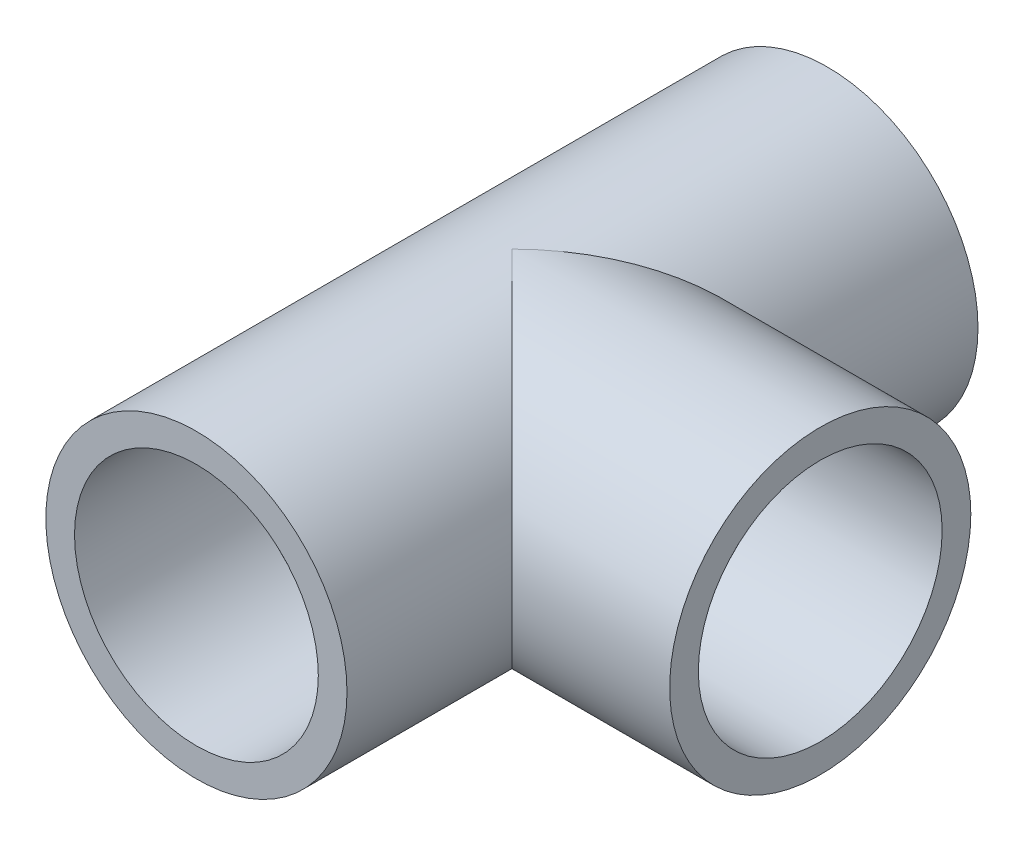
ISO-10303-21;
HEADER;
FILE_DESCRIPTION(('STEP AP214'),'2;1');
FILE_NAME('part.step','',(''),(''),'','','');
FILE_SCHEMA(('AUTOMOTIVE_DESIGN { 1 0 10303 214 1 1 1 1 }'));
ENDSEC;
DATA;
#1=APPLICATION_CONTEXT('core data for automotive mechanical design processes');
#2=APPLICATION_PROTOCOL_DEFINITION('international standard','automotive_design',2000,#1);
#3=PRODUCT_CONTEXT('',#1,'mechanical');
#4=PRODUCT('Part','Part','',(#3));
#5=PRODUCT_RELATED_PRODUCT_CATEGORY('part','',(#4));
#6=PRODUCT_DEFINITION_FORMATION('','',#4);
#7=PRODUCT_DEFINITION_CONTEXT('part definition',#1,'design');
#8=PRODUCT_DEFINITION('design','',#6,#7);
#9=PRODUCT_DEFINITION_SHAPE('','',#8);
#10=(LENGTH_UNIT() NAMED_UNIT(*) SI_UNIT(.MILLI.,.METRE.));
#11=(NAMED_UNIT(*) PLANE_ANGLE_UNIT() SI_UNIT($,.RADIAN.));
#12=(NAMED_UNIT(*) SI_UNIT($,.STERADIAN.) SOLID_ANGLE_UNIT());
#13=UNCERTAINTY_MEASURE_WITH_UNIT(LENGTH_MEASURE(1.E-05),#10,'distance_accuracy_value','');
#14=(GEOMETRIC_REPRESENTATION_CONTEXT(3) GLOBAL_UNCERTAINTY_ASSIGNED_CONTEXT((#13)) GLOBAL_UNIT_ASSIGNED_CONTEXT((#10,
#11,#12)) REPRESENTATION_CONTEXT('',''));
#15=CARTESIAN_POINT('',(0.,0.,0.));
#16=DIRECTION('',(0.,0.,1.));
#17=DIRECTION('',(1.,0.,0.));
#18=AXIS2_PLACEMENT_3D('',#15,#16,#17);
#19=CARTESIAN_POINT('',(0.,0.,69.85));
#20=DIRECTION('',(0.,0.,-1.));
#21=DIRECTION('',(-1.,0.,0.));
#22=AXIS2_PLACEMENT_3D('',#19,#20,#21);
#23=CYLINDRICAL_SURFACE('',#22,12.7);
#24=CARTESIAN_POINT('',(0.,0.,50.8));
#25=DIRECTION('',(0.,0.,1.));
#26=DIRECTION('',(1.,0.,0.));
#27=AXIS2_PLACEMENT_3D('',#24,#25,#26);
#28=CIRCLE('',#27,12.7);
#29=CARTESIAN_POINT('',(12.7,0.,50.8));
#30=VERTEX_POINT('',#29);
#31=EDGE_CURVE('E114',#30,#30,#28,.F.);
#32=ORIENTED_EDGE('',*,*,#31,.F.);
#33=EDGE_LOOP('',(#32));
#34=FACE_BOUND('',#33,.T.);
#35=DIRECTION('',(0.,0.,-1.));
#36=VECTOR('',#35,1.);
#37=CARTESIAN_POINT('',(3.65125,-12.1638140991015,69.85));
#38=LINE('',#37,#36);
#39=CARTESIAN_POINT('',(3.65125,-12.1638140991015,38.57625));
#40=VERTEX_POINT('',#39);
#41=CARTESIAN_POINT('',(3.65125,-12.1638140991015,31.27375));
#42=VERTEX_POINT('',#41);
#43=EDGE_CURVE('E11',#40,#42,#38,.T.);
#44=ORIENTED_EDGE('',*,*,#43,.T.);
#45=CARTESIAN_POINT('',(0.,0.,34.925));
#46=DIRECTION('',(0.707106781186547,0.,0.707106781186548));
#47=DIRECTION('',(0.707106781186547,0.,-0.707106781186548));
#48=AXIS2_PLACEMENT_3D('',#45,#46,#47);
#49=ELLIPSE('',#48,17.9605122421383,12.7);
#50=CARTESIAN_POINT('',(3.65125,12.1638140991015,31.27375));
#51=VERTEX_POINT('',#50);
#52=EDGE_CURVE('E56',#51,#42,#49,.F.);
#53=ORIENTED_EDGE('',*,*,#52,.F.);
#54=DIRECTION('',(0.,0.,-1.));
#55=VECTOR('',#54,1.);
#56=CARTESIAN_POINT('',(3.65125,12.1638140991015,69.85));
#57=LINE('',#56,#55);
#58=CARTESIAN_POINT('',(3.65125,12.1638140991015,38.57625));
#59=VERTEX_POINT('',#58);
#60=EDGE_CURVE('E49',#51,#59,#57,.F.);
#61=ORIENTED_EDGE('',*,*,#60,.T.);
#62=CARTESIAN_POINT('',(0.,0.,34.925));
#63=DIRECTION('',(0.707106781186547,0.,-0.707106781186548));
#64=DIRECTION('',(0.707106781186547,0.,0.707106781186548));
#65=AXIS2_PLACEMENT_3D('',#62,#63,#64);
#66=ELLIPSE('',#65,17.9605122421383,12.7);
#67=EDGE_CURVE('E75',#40,#59,#66,.F.);
#68=ORIENTED_EDGE('',*,*,#67,.F.);
#69=EDGE_LOOP('',(#44,#53,#61,#68));
#70=FACE_BOUND('',#69,.T.);
#71=CARTESIAN_POINT('',(0.,0.,19.05));
#72=DIRECTION('',(0.,0.,-1.));
#73=DIRECTION('',(-1.,0.,0.));
#74=AXIS2_PLACEMENT_3D('',#71,#72,#73);
#75=CIRCLE('',#74,12.7);
#76=CARTESIAN_POINT('',(-12.7,0.,19.05));
#77=VERTEX_POINT('',#76);
#78=EDGE_CURVE('E43',#77,#77,#75,.F.);
#79=ORIENTED_EDGE('',*,*,#78,.F.);
#80=EDGE_LOOP('',(#79));
#81=FACE_BOUND('',#80,.T.);
#82=ADVANCED_FACE('F39',(#34,#70,#81),#23,.F.);
#83=CARTESIAN_POINT('',(3.65125,0.,34.925));
#84=DIRECTION('',(1.,0.,0.));
#85=DIRECTION('',(0.,0.,-1.));
#86=AXIS2_PLACEMENT_3D('',#83,#84,#85);
#87=CYLINDRICAL_SURFACE('',#86,12.7);
#88=CARTESIAN_POINT('',(3.65125,0.,34.925));
#89=DIRECTION('',(1.,0.,0.));
#90=DIRECTION('',(0.,0.,-1.));
#91=AXIS2_PLACEMENT_3D('',#88,#89,#90);
#92=CIRCLE('',#91,12.7);
#93=EDGE_CURVE('E89',#40,#42,#92,.T.);
#94=ORIENTED_EDGE('',*,*,#93,.F.);
#95=ORIENTED_EDGE('',*,*,#67,.T.);
#96=EDGE_CURVE('E87',#51,#59,#92,.T.);
#97=ORIENTED_EDGE('',*,*,#96,.F.);
#98=ORIENTED_EDGE('',*,*,#52,.T.);
#99=EDGE_LOOP('',(#94,#95,#97,#98));
#100=FACE_BOUND('',#99,.T.);
#101=CARTESIAN_POINT('',(15.08125,0.,34.925));
#102=DIRECTION('',(1.,0.,0.));
#103=DIRECTION('',(0.,0.,-1.));
#104=AXIS2_PLACEMENT_3D('',#101,#102,#103);
#105=CIRCLE('',#104,12.7);
#106=CARTESIAN_POINT('',(15.08125,0.,22.225));
#107=VERTEX_POINT('',#106);
#108=EDGE_CURVE('E118',#107,#107,#105,.F.);
#109=ORIENTED_EDGE('',*,*,#108,.F.);
#110=EDGE_LOOP('',(#109));
#111=FACE_BOUND('',#110,.T.);
#112=ADVANCED_FACE('F85',(#100,#111),#87,.F.);
#113=CARTESIAN_POINT('',(3.65125,0.,34.925));
#114=DIRECTION('',(1.,0.,0.));
#115=DIRECTION('',(0.,0.,-1.));
#116=AXIS2_PLACEMENT_3D('',#113,#114,#115);
#117=PLANE('',#116);
#118=ORIENTED_EDGE('',*,*,#43,.F.);
#119=ORIENTED_EDGE('',*,*,#93,.T.);
#120=EDGE_LOOP('',(#118,#119));
#121=FACE_BOUND('',#120,.T.);
#122=ADVANCED_FACE('F145',(#121),#117,.T.);
#123=CARTESIAN_POINT('',(0.,0.,69.85));
#124=DIRECTION('',(0.,0.,-1.));
#125=DIRECTION('',(-1.,0.,0.));
#126=AXIS2_PLACEMENT_3D('',#123,#124,#125);
#127=CYLINDRICAL_SURFACE('',#126,16.66875);
#128=CARTESIAN_POINT('',(0.,0.,0.));
#129=DIRECTION('',(0.,0.,1.));
#130=DIRECTION('',(1.,0.,0.));
#131=AXIS2_PLACEMENT_3D('',#128,#129,#130);
#132=CIRCLE('',#131,16.66875);
#133=CARTESIAN_POINT('',(16.66875,0.,0.));
#134=VERTEX_POINT('',#133);
#135=EDGE_CURVE('E99',#134,#134,#132,.T.);
#136=ORIENTED_EDGE('',*,*,#135,.T.);
#137=EDGE_LOOP('',(#136));
#138=FACE_BOUND('',#137,.T.);
#139=CARTESIAN_POINT('',(0.,0.,69.85));
#140=DIRECTION('',(0.,0.,1.));
#141=DIRECTION('',(1.,0.,0.));
#142=AXIS2_PLACEMENT_3D('',#139,#140,#141);
#143=CIRCLE('',#142,16.66875);
#144=CARTESIAN_POINT('',(16.66875,0.,69.85));
#145=VERTEX_POINT('',#144);
#146=EDGE_CURVE('E103',#145,#145,#143,.T.);
#147=ORIENTED_EDGE('',*,*,#146,.F.);
#148=EDGE_LOOP('',(#147));
#149=FACE_BOUND('',#148,.T.);
#150=CARTESIAN_POINT('',(0.,0.,34.925));
#151=DIRECTION('',(-0.707106781186547,0.,-0.707106781186547));
#152=DIRECTION('',(0.707106781186547,0.,-0.707106781186547));
#153=AXIS2_PLACEMENT_3D('',#150,#151,#152);
#154=ELLIPSE('',#153,23.5731723178065,16.66875);
#155=CARTESIAN_POINT('',(0.,-16.66875,34.925));
#156=VERTEX_POINT('',#155);
#157=CARTESIAN_POINT('',(0.,16.66875,34.925));
#158=VERTEX_POINT('',#157);
#159=EDGE_CURVE('E81',#156,#158,#154,.F.);
#160=ORIENTED_EDGE('',*,*,#159,.F.);
#161=CARTESIAN_POINT('',(0.,0.,34.925));
#162=DIRECTION('',(0.707106781186547,0.,-0.707106781186547));
#163=DIRECTION('',(-0.707106781186547,0.,-0.707106781186547));
#164=AXIS2_PLACEMENT_3D('',#161,#162,#163);
#165=ELLIPSE('',#164,23.5731723178065,16.66875);
#166=EDGE_CURVE('E63',#158,#156,#165,.T.);
#167=ORIENTED_EDGE('',*,*,#166,.F.);
#168=EDGE_LOOP('',(#160,#167));
#169=FACE_BOUND('',#168,.T.);
#170=ADVANCED_FACE('F41',(#138,#149,#169),#127,.T.);
#171=CARTESIAN_POINT('',(0.,0.,69.85));
#172=DIRECTION('',(0.,0.,1.));
#173=DIRECTION('',(1.,0.,0.));
#174=AXIS2_PLACEMENT_3D('',#171,#172,#173);
#175=PLANE('',#174);
#176=CARTESIAN_POINT('',(0.,0.,69.85));
#177=DIRECTION('',(0.,0.,1.));
#178=DIRECTION('',(1.,0.,0.));
#179=AXIS2_PLACEMENT_3D('',#176,#177,#178);
#180=CIRCLE('',#179,13.49375);
#181=CARTESIAN_POINT('',(13.49375,0.,69.85));
#182=VERTEX_POINT('',#181);
#183=EDGE_CURVE('E121',#182,#182,#180,.T.);
#184=ORIENTED_EDGE('',*,*,#183,.F.);
#185=EDGE_LOOP('',(#184));
#186=FACE_BOUND('',#185,.T.);
#187=ORIENTED_EDGE('',*,*,#146,.T.);
#188=EDGE_LOOP('',(#187));
#189=FACE_BOUND('',#188,.T.);
#190=ADVANCED_FACE('F152',(#186,#189),#175,.T.);
#191=CARTESIAN_POINT('',(0.,0.,0.));
#192=DIRECTION('',(0.,0.,1.));
#193=DIRECTION('',(1.,0.,0.));
#194=AXIS2_PLACEMENT_3D('',#191,#192,#193);
#195=PLANE('',#194);
#196=CARTESIAN_POINT('',(0.,0.,0.));
#197=DIRECTION('',(0.,0.,-1.));
#198=DIRECTION('',(-1.,0.,0.));
#199=AXIS2_PLACEMENT_3D('',#196,#197,#198);
#200=CIRCLE('',#199,13.49375);
#201=CARTESIAN_POINT('',(-13.49375,0.,0.));
#202=VERTEX_POINT('',#201);
#203=EDGE_CURVE('E138',#202,#202,#200,.T.);
#204=ORIENTED_EDGE('',*,*,#203,.F.);
#205=EDGE_LOOP('',(#204));
#206=FACE_BOUND('',#205,.T.);
#207=ORIENTED_EDGE('',*,*,#135,.F.);
#208=EDGE_LOOP('',(#207));
#209=FACE_BOUND('',#208,.T.);
#210=ADVANCED_FACE('F201',(#206,#209),#195,.F.);
#211=CARTESIAN_POINT('',(34.13125,0.,34.925));
#212=DIRECTION('',(-1.,0.,0.));
#213=DIRECTION('',(0.,0.,1.));
#214=AXIS2_PLACEMENT_3D('',#211,#212,#213);
#215=CYLINDRICAL_SURFACE('',#214,16.66875);
#216=CARTESIAN_POINT('',(34.13125,0.,34.925));
#217=DIRECTION('',(1.,0.,0.));
#218=DIRECTION('',(0.,0.,-1.));
#219=AXIS2_PLACEMENT_3D('',#216,#217,#218);
#220=CIRCLE('',#219,16.66875);
#221=CARTESIAN_POINT('',(34.13125,0.,18.25625));
#222=VERTEX_POINT('',#221);
#223=EDGE_CURVE('E94',#222,#222,#220,.T.);
#224=ORIENTED_EDGE('',*,*,#223,.F.);
#225=EDGE_LOOP('',(#224));
#226=FACE_BOUND('',#225,.T.);
#227=ORIENTED_EDGE('',*,*,#166,.T.);
#228=ORIENTED_EDGE('',*,*,#159,.T.);
#229=EDGE_LOOP('',(#227,#228));
#230=FACE_BOUND('',#229,.T.);
#231=ADVANCED_FACE('F204',(#226,#230),#215,.T.);
#232=CARTESIAN_POINT('',(34.13125,0.,34.925));
#233=DIRECTION('',(1.,0.,0.));
#234=DIRECTION('',(0.,0.,-1.));
#235=AXIS2_PLACEMENT_3D('',#232,#233,#234);
#236=PLANE('',#235);
#237=CARTESIAN_POINT('',(34.13125,0.,34.925));
#238=DIRECTION('',(1.,0.,0.));
#239=DIRECTION('',(0.,0.,-1.));
#240=AXIS2_PLACEMENT_3D('',#237,#238,#239);
#241=CIRCLE('',#240,13.49375);
#242=CARTESIAN_POINT('',(34.13125,0.,21.43125));
#243=VERTEX_POINT('',#242);
#244=EDGE_CURVE('E130',#243,#243,#241,.T.);
#245=ORIENTED_EDGE('',*,*,#244,.F.);
#246=EDGE_LOOP('',(#245));
#247=FACE_BOUND('',#246,.T.);
#248=ORIENTED_EDGE('',*,*,#223,.T.);
#249=EDGE_LOOP('',(#248));
#250=FACE_BOUND('',#249,.T.);
#251=ADVANCED_FACE('F158',(#247,#250),#236,.T.);
#252=ORIENTED_EDGE('',*,*,#60,.F.);
#253=ORIENTED_EDGE('',*,*,#96,.T.);
#254=EDGE_LOOP('',(#252,#253));
#255=FACE_BOUND('',#254,.T.);
#256=ADVANCED_FACE('F92',(#255),#117,.T.);
#257=CARTESIAN_POINT('',(0.,0.,50.8));
#258=DIRECTION('',(0.,0.,1.));
#259=DIRECTION('',(1.,0.,0.));
#260=AXIS2_PLACEMENT_3D('',#257,#258,#259);
#261=PLANE('',#260);
#262=CARTESIAN_POINT('',(0.,0.,50.8));
#263=DIRECTION('',(0.,0.,1.));
#264=DIRECTION('',(1.,0.,0.));
#265=AXIS2_PLACEMENT_3D('',#262,#263,#264);
#266=CIRCLE('',#265,13.49375);
#267=CARTESIAN_POINT('',(13.49375,0.,50.8));
#268=VERTEX_POINT('',#267);
#269=EDGE_CURVE('E117',#268,#268,#266,.T.);
#270=ORIENTED_EDGE('',*,*,#269,.T.);
#271=EDGE_LOOP('',(#270));
#272=FACE_BOUND('',#271,.T.);
#273=ORIENTED_EDGE('',*,*,#31,.T.);
#274=EDGE_LOOP('',(#273));
#275=FACE_BOUND('',#274,.T.);
#276=ADVANCED_FACE('F157',(#272,#275),#261,.T.);
#277=CARTESIAN_POINT('',(0.,0.,50.8));
#278=DIRECTION('',(0.,0.,1.));
#279=DIRECTION('',(1.,0.,0.));
#280=AXIS2_PLACEMENT_3D('',#277,#278,#279);
#281=CYLINDRICAL_SURFACE('',#280,13.49375);
#282=CARTESIAN_POINT('',(13.49375,0.,50.8));
#283=CARTESIAN_POINT('',(13.49375,0.,50.9984375));
#284=CARTESIAN_POINT('',(13.49375,0.,51.196875));
#285=CARTESIAN_POINT('',(13.49375,0.,51.59375));
#286=CARTESIAN_POINT('',(13.49375,0.,51.7921875));
#287=CARTESIAN_POINT('',(13.49375,0.,52.1890625));
#288=CARTESIAN_POINT('',(13.49375,0.,52.3875));
#289=CARTESIAN_POINT('',(13.49375,0.,52.784375));
#290=CARTESIAN_POINT('',(13.49375,0.,52.9828125));
#291=CARTESIAN_POINT('',(13.49375,0.,53.3796875));
#292=CARTESIAN_POINT('',(13.49375,0.,53.578125));
#293=CARTESIAN_POINT('',(13.49375,0.,53.975));
#294=CARTESIAN_POINT('',(13.49375,0.,54.1734375));
#295=CARTESIAN_POINT('',(13.49375,0.,54.5703125));
#296=CARTESIAN_POINT('',(13.49375,0.,54.76875));
#297=CARTESIAN_POINT('',(13.49375,0.,55.165625));
#298=CARTESIAN_POINT('',(13.49375,0.,55.3640625));
#299=CARTESIAN_POINT('',(13.49375,0.,55.7609375));
#300=CARTESIAN_POINT('',(13.49375,0.,55.959375));
#301=CARTESIAN_POINT('',(13.49375,0.,56.35625));
#302=CARTESIAN_POINT('',(13.49375,0.,56.5546875));
#303=CARTESIAN_POINT('',(13.49375,0.,56.9515625));
#304=CARTESIAN_POINT('',(13.49375,0.,57.15));
#305=CARTESIAN_POINT('',(13.49375,0.,57.546875));
#306=CARTESIAN_POINT('',(13.49375,0.,57.7453125));
#307=CARTESIAN_POINT('',(13.49375,0.,58.1421875));
#308=CARTESIAN_POINT('',(13.49375,0.,58.340625));
#309=CARTESIAN_POINT('',(13.49375,0.,58.7375));
#310=CARTESIAN_POINT('',(13.49375,0.,58.9359375));
#311=CARTESIAN_POINT('',(13.49375,0.,59.3328125));
#312=CARTESIAN_POINT('',(13.49375,0.,59.53125));
#313=CARTESIAN_POINT('',(13.49375,0.,59.928125));
#314=CARTESIAN_POINT('',(13.49375,0.,60.1265625));
#315=CARTESIAN_POINT('',(13.49375,0.,60.5234375));
#316=CARTESIAN_POINT('',(13.49375,0.,60.721875));
#317=CARTESIAN_POINT('',(13.49375,0.,61.11875));
#318=CARTESIAN_POINT('',(13.49375,0.,61.3171875));
#319=CARTESIAN_POINT('',(13.49375,0.,61.7140625));
#320=CARTESIAN_POINT('',(13.49375,0.,61.9125));
#321=CARTESIAN_POINT('',(13.49375,0.,62.309375));
#322=CARTESIAN_POINT('',(13.49375,0.,62.5078125));
#323=CARTESIAN_POINT('',(13.49375,0.,62.9046875));
#324=CARTESIAN_POINT('',(13.49375,0.,63.103125));
#325=CARTESIAN_POINT('',(13.49375,0.,63.5));
#326=CARTESIAN_POINT('',(13.49375,0.,63.6984375));
#327=CARTESIAN_POINT('',(13.49375,0.,64.0953125));
#328=CARTESIAN_POINT('',(13.49375,0.,64.29375));
#329=CARTESIAN_POINT('',(13.49375,0.,64.690625));
#330=CARTESIAN_POINT('',(13.49375,0.,64.8890625));
#331=CARTESIAN_POINT('',(13.49375,0.,65.2859375));
#332=CARTESIAN_POINT('',(13.49375,0.,65.484375));
#333=CARTESIAN_POINT('',(13.49375,0.,65.88125));
#334=CARTESIAN_POINT('',(13.49375,0.,66.0796875));
#335=CARTESIAN_POINT('',(13.49375,0.,66.4765625));
#336=CARTESIAN_POINT('',(13.49375,0.,66.675));
#337=CARTESIAN_POINT('',(13.49375,0.,67.071875));
#338=CARTESIAN_POINT('',(13.49375,0.,67.2703125));
#339=CARTESIAN_POINT('',(13.49375,0.,67.6671875));
#340=CARTESIAN_POINT('',(13.49375,0.,67.865625));
#341=CARTESIAN_POINT('',(13.49375,0.,68.2625));
#342=CARTESIAN_POINT('',(13.49375,0.,68.4609375));
#343=CARTESIAN_POINT('',(13.49375,0.,68.8578125));
#344=CARTESIAN_POINT('',(13.49375,0.,69.05625));
#345=CARTESIAN_POINT('',(13.49375,0.,69.453125));
#346=CARTESIAN_POINT('',(13.49375,0.,69.6515625));
#347=CARTESIAN_POINT('',(13.49375,0.,69.85));
#348=B_SPLINE_CURVE_WITH_KNOTS('',3,(#282,#283,#284,#285,#286,#287,#288,#289,#290,#291,#292,
#293,#294,#295,#296,#297,#298,#299,#300,#301,#302,#303,#304,#305,#306,#307,#308,#309,#310,#311,
#312,#313,#314,#315,#316,#317,#318,#319,#320,#321,#322,#323,#324,#325,#326,#327,#328,#329,#330,
#331,#332,#333,#334,#335,#336,#337,#338,#339,#340,#341,#342,#343,#344,#345,#346,#347),
.UNSPECIFIED.,.F.,.F.,(4,2,2,2,2,2,2,2,2,2,2,2,2,2,2,2,2,2,2,2,2,2,2,2,2,2,2,2,2,2,2,2,4),(0.,
0.5953125,1.190625,1.7859375,2.38125,2.9765625,3.571875,4.1671875,4.7625,5.3578125,5.953125,
6.5484375,7.14375,7.7390625,8.334375,8.9296875,9.525,10.1203125,10.715625,11.3109375,11.90625,
12.5015625,13.096875,13.6921875,14.2875,14.8828125,15.478125,16.0734375,16.66875,17.2640625,
17.859375,18.4546875,19.05),.UNSPECIFIED.);
#349=EDGE_CURVE('BSEAM165',#268,#182,#348,.T.);
#350=ORIENTED_EDGE('',*,*,#269,.F.);
#351=ORIENTED_EDGE('',*,*,#183,.T.);
#352=ORIENTED_EDGE('',*,*,#349,.T.);
#353=ORIENTED_EDGE('',*,*,#349,.F.);
#354=EDGE_LOOP('',(#350,#352,#351,#353));
#355=FACE_BOUND('',#354,.T.);
#356=ADVANCED_FACE('F165',(#355),#281,.F.);
#357=CARTESIAN_POINT('',(15.08125,0.,34.925));
#358=DIRECTION('',(1.,0.,0.));
#359=DIRECTION('',(0.,0.,-1.));
#360=AXIS2_PLACEMENT_3D('',#357,#358,#359);
#361=PLANE('',#360);
#362=CARTESIAN_POINT('',(15.08125,0.,34.925));
#363=DIRECTION('',(1.,0.,0.));
#364=DIRECTION('',(0.,0.,-1.));
#365=AXIS2_PLACEMENT_3D('',#362,#363,#364);
#366=CIRCLE('',#365,13.49375);
#367=CARTESIAN_POINT('',(15.08125,0.,21.43125));
#368=VERTEX_POINT('',#367);
#369=EDGE_CURVE('E122',#368,#368,#366,.T.);
#370=ORIENTED_EDGE('',*,*,#369,.T.);
#371=EDGE_LOOP('',(#370));
#372=FACE_BOUND('',#371,.T.);
#373=ORIENTED_EDGE('',*,*,#108,.T.);
#374=EDGE_LOOP('',(#373));
#375=FACE_BOUND('',#374,.T.);
#376=ADVANCED_FACE('F168',(#372,#375),#361,.T.);
#377=CARTESIAN_POINT('',(15.08125,0.,34.925));
#378=DIRECTION('',(1.,0.,0.));
#379=DIRECTION('',(0.,0.,-1.));
#380=AXIS2_PLACEMENT_3D('',#377,#378,#379);
#381=CYLINDRICAL_SURFACE('',#380,13.49375);
#382=CARTESIAN_POINT('',(15.08125,0.,21.43125));
#383=CARTESIAN_POINT('',(15.2796875,0.,21.43125));
#384=CARTESIAN_POINT('',(15.478125,0.,21.43125));
#385=CARTESIAN_POINT('',(15.875,0.,21.43125));
#386=CARTESIAN_POINT('',(16.0734375,0.,21.43125));
#387=CARTESIAN_POINT('',(16.4703125,0.,21.43125));
#388=CARTESIAN_POINT('',(16.66875,0.,21.43125));
#389=CARTESIAN_POINT('',(17.065625,0.,21.43125));
#390=CARTESIAN_POINT('',(17.2640625,0.,21.43125));
#391=CARTESIAN_POINT('',(17.6609375,0.,21.43125));
#392=CARTESIAN_POINT('',(17.859375,0.,21.43125));
#393=CARTESIAN_POINT('',(18.25625,0.,21.43125));
#394=CARTESIAN_POINT('',(18.4546875,0.,21.43125));
#395=CARTESIAN_POINT('',(18.8515625,0.,21.43125));
#396=CARTESIAN_POINT('',(19.05,0.,21.43125));
#397=CARTESIAN_POINT('',(19.446875,0.,21.43125));
#398=CARTESIAN_POINT('',(19.6453125,0.,21.43125));
#399=CARTESIAN_POINT('',(20.0421875,0.,21.43125));
#400=CARTESIAN_POINT('',(20.240625,0.,21.43125));
#401=CARTESIAN_POINT('',(20.6375,0.,21.43125));
#402=CARTESIAN_POINT('',(20.8359375,0.,21.43125));
#403=CARTESIAN_POINT('',(21.2328125,0.,21.43125));
#404=CARTESIAN_POINT('',(21.43125,0.,21.43125));
#405=CARTESIAN_POINT('',(21.828125,0.,21.43125));
#406=CARTESIAN_POINT('',(22.0265625,0.,21.43125));
#407=CARTESIAN_POINT('',(22.4234375,0.,21.43125));
#408=CARTESIAN_POINT('',(22.621875,0.,21.43125));
#409=CARTESIAN_POINT('',(23.01875,0.,21.43125));
#410=CARTESIAN_POINT('',(23.2171875,0.,21.43125));
#411=CARTESIAN_POINT('',(23.6140625,0.,21.43125));
#412=CARTESIAN_POINT('',(23.8125,0.,21.43125));
#413=CARTESIAN_POINT('',(24.209375,0.,21.43125));
#414=CARTESIAN_POINT('',(24.4078125,0.,21.43125));
#415=CARTESIAN_POINT('',(24.8046875,0.,21.43125));
#416=CARTESIAN_POINT('',(25.003125,0.,21.43125));
#417=CARTESIAN_POINT('',(25.4,0.,21.43125));
#418=CARTESIAN_POINT('',(25.5984375,0.,21.43125));
#419=CARTESIAN_POINT('',(25.9953125,0.,21.43125));
#420=CARTESIAN_POINT('',(26.19375,0.,21.43125));
#421=CARTESIAN_POINT('',(26.590625,0.,21.43125));
#422=CARTESIAN_POINT('',(26.7890625,0.,21.43125));
#423=CARTESIAN_POINT('',(27.1859375,0.,21.43125));
#424=CARTESIAN_POINT('',(27.384375,0.,21.43125));
#425=CARTESIAN_POINT('',(27.78125,0.,21.43125));
#426=CARTESIAN_POINT('',(27.9796875,0.,21.43125));
#427=CARTESIAN_POINT('',(28.3765625,0.,21.43125));
#428=CARTESIAN_POINT('',(28.575,0.,21.43125));
#429=CARTESIAN_POINT('',(28.971875,0.,21.43125));
#430=CARTESIAN_POINT('',(29.1703125,0.,21.43125));
#431=CARTESIAN_POINT('',(29.5671875,0.,21.43125));
#432=CARTESIAN_POINT('',(29.765625,0.,21.43125));
#433=CARTESIAN_POINT('',(30.1625,0.,21.43125));
#434=CARTESIAN_POINT('',(30.3609375,0.,21.43125));
#435=CARTESIAN_POINT('',(30.7578125,0.,21.43125));
#436=CARTESIAN_POINT('',(30.95625,0.,21.43125));
#437=CARTESIAN_POINT('',(31.353125,0.,21.43125));
#438=CARTESIAN_POINT('',(31.5515625,0.,21.43125));
#439=CARTESIAN_POINT('',(31.9484375,0.,21.43125));
#440=CARTESIAN_POINT('',(32.146875,0.,21.43125));
#441=CARTESIAN_POINT('',(32.54375,0.,21.43125));
#442=CARTESIAN_POINT('',(32.7421875,0.,21.43125));
#443=CARTESIAN_POINT('',(33.1390625,0.,21.43125));
#444=CARTESIAN_POINT('',(33.3375,0.,21.43125));
#445=CARTESIAN_POINT('',(33.734375,0.,21.43125));
#446=CARTESIAN_POINT('',(33.9328125,0.,21.43125));
#447=CARTESIAN_POINT('',(34.13125,0.,21.43125));
#448=B_SPLINE_CURVE_WITH_KNOTS('',3,(#382,#383,#384,#385,#386,#387,#388,#389,#390,#391,#392,
#393,#394,#395,#396,#397,#398,#399,#400,#401,#402,#403,#404,#405,#406,#407,#408,#409,#410,#411,
#412,#413,#414,#415,#416,#417,#418,#419,#420,#421,#422,#423,#424,#425,#426,#427,#428,#429,#430,
#431,#432,#433,#434,#435,#436,#437,#438,#439,#440,#441,#442,#443,#444,#445,#446,#447),
.UNSPECIFIED.,.F.,.F.,(4,2,2,2,2,2,2,2,2,2,2,2,2,2,2,2,2,2,2,2,2,2,2,2,2,2,2,2,2,2,2,2,4),(0.,
0.5953125,1.190625,1.7859375,2.38125,2.9765625,3.571875,4.1671875,4.7625,5.3578125,5.953125,
6.5484375,7.14375,7.7390625,8.33437499999999,8.92968749999999,9.525,10.1203125,10.715625,
11.3109375,11.90625,12.5015625,13.096875,13.6921875,14.2875,14.8828125,15.478125,16.0734375,
16.66875,17.2640625,17.859375,18.4546875,19.05),.UNSPECIFIED.);
#449=EDGE_CURVE('BSEAM173',#368,#243,#448,.T.);
#450=ORIENTED_EDGE('',*,*,#369,.F.);
#451=ORIENTED_EDGE('',*,*,#244,.T.);
#452=ORIENTED_EDGE('',*,*,#449,.T.);
#453=ORIENTED_EDGE('',*,*,#449,.F.);
#454=EDGE_LOOP('',(#450,#452,#451,#453));
#455=FACE_BOUND('',#454,.T.);
#456=ADVANCED_FACE('F173',(#455),#381,.F.);
#457=CARTESIAN_POINT('',(0.,0.,19.05));
#458=DIRECTION('',(0.,0.,-1.));
#459=DIRECTION('',(-1.,0.,0.));
#460=AXIS2_PLACEMENT_3D('',#457,#458,#459);
#461=PLANE('',#460);
#462=CARTESIAN_POINT('',(0.,0.,19.05));
#463=DIRECTION('',(0.,0.,-1.));
#464=DIRECTION('',(-1.,0.,0.));
#465=AXIS2_PLACEMENT_3D('',#462,#463,#464);
#466=CIRCLE('',#465,13.49375);
#467=CARTESIAN_POINT('',(-13.49375,0.,19.05));
#468=VERTEX_POINT('',#467);
#469=EDGE_CURVE('E191',#468,#468,#466,.T.);
#470=ORIENTED_EDGE('',*,*,#469,.T.);
#471=EDGE_LOOP('',(#470));
#472=FACE_BOUND('',#471,.T.);
#473=ORIENTED_EDGE('',*,*,#78,.T.);
#474=EDGE_LOOP('',(#473));
#475=FACE_BOUND('',#474,.T.);
#476=ADVANCED_FACE('F176',(#472,#475),#461,.T.);
#477=CARTESIAN_POINT('',(0.,0.,19.05));
#478=DIRECTION('',(0.,0.,-1.));
#479=DIRECTION('',(-1.,0.,0.));
#480=AXIS2_PLACEMENT_3D('',#477,#478,#479);
#481=CYLINDRICAL_SURFACE('',#480,13.49375);
#482=CARTESIAN_POINT('',(-13.49375,0.,19.05));
#483=CARTESIAN_POINT('',(-13.49375,0.,18.8515625));
#484=CARTESIAN_POINT('',(-13.49375,0.,18.653125));
#485=CARTESIAN_POINT('',(-13.49375,0.,18.25625));
#486=CARTESIAN_POINT('',(-13.49375,0.,18.0578125));
#487=CARTESIAN_POINT('',(-13.49375,0.,17.6609375));
#488=CARTESIAN_POINT('',(-13.49375,0.,17.4625));
#489=CARTESIAN_POINT('',(-13.49375,0.,17.065625));
#490=CARTESIAN_POINT('',(-13.49375,0.,16.8671875));
#491=CARTESIAN_POINT('',(-13.49375,0.,16.4703125));
#492=CARTESIAN_POINT('',(-13.49375,0.,16.271875));
#493=CARTESIAN_POINT('',(-13.49375,0.,15.875));
#494=CARTESIAN_POINT('',(-13.49375,0.,15.6765625));
#495=CARTESIAN_POINT('',(-13.49375,0.,15.2796875));
#496=CARTESIAN_POINT('',(-13.49375,0.,15.08125));
#497=CARTESIAN_POINT('',(-13.49375,0.,14.684375));
#498=CARTESIAN_POINT('',(-13.49375,0.,14.4859375));
#499=CARTESIAN_POINT('',(-13.49375,0.,14.0890625));
#500=CARTESIAN_POINT('',(-13.49375,0.,13.890625));
#501=CARTESIAN_POINT('',(-13.49375,0.,13.49375));
#502=CARTESIAN_POINT('',(-13.49375,0.,13.2953125));
#503=CARTESIAN_POINT('',(-13.49375,0.,12.8984375));
#504=CARTESIAN_POINT('',(-13.49375,0.,12.7));
#505=CARTESIAN_POINT('',(-13.49375,0.,12.303125));
#506=CARTESIAN_POINT('',(-13.49375,0.,12.1046875));
#507=CARTESIAN_POINT('',(-13.49375,0.,11.7078125));
#508=CARTESIAN_POINT('',(-13.49375,0.,11.509375));
#509=CARTESIAN_POINT('',(-13.49375,0.,11.1125));
#510=CARTESIAN_POINT('',(-13.49375,0.,10.9140625));
#511=CARTESIAN_POINT('',(-13.49375,0.,10.5171875));
#512=CARTESIAN_POINT('',(-13.49375,0.,10.31875));
#513=CARTESIAN_POINT('',(-13.49375,0.,9.921875));
#514=CARTESIAN_POINT('',(-13.49375,0.,9.7234375));
#515=CARTESIAN_POINT('',(-13.49375,0.,9.3265625));
#516=CARTESIAN_POINT('',(-13.49375,0.,9.128125));
#517=CARTESIAN_POINT('',(-13.49375,0.,8.73125));
#518=CARTESIAN_POINT('',(-13.49375,0.,8.5328125));
#519=CARTESIAN_POINT('',(-13.49375,0.,8.1359375));
#520=CARTESIAN_POINT('',(-13.49375,0.,7.9375));
#521=CARTESIAN_POINT('',(-13.49375,0.,7.540625));
#522=CARTESIAN_POINT('',(-13.49375,0.,7.3421875));
#523=CARTESIAN_POINT('',(-13.49375,0.,6.9453125));
#524=CARTESIAN_POINT('',(-13.49375,0.,6.746875));
#525=CARTESIAN_POINT('',(-13.49375,0.,6.35));
#526=CARTESIAN_POINT('',(-13.49375,0.,6.1515625));
#527=CARTESIAN_POINT('',(-13.49375,0.,5.7546875));
#528=CARTESIAN_POINT('',(-13.49375,0.,5.55625));
#529=CARTESIAN_POINT('',(-13.49375,0.,5.159375));
#530=CARTESIAN_POINT('',(-13.49375,0.,4.9609375));
#531=CARTESIAN_POINT('',(-13.49375,0.,4.5640625));
#532=CARTESIAN_POINT('',(-13.49375,0.,4.365625));
#533=CARTESIAN_POINT('',(-13.49375,0.,3.96875));
#534=CARTESIAN_POINT('',(-13.49375,0.,3.7703125));
#535=CARTESIAN_POINT('',(-13.49375,0.,3.3734375));
#536=CARTESIAN_POINT('',(-13.49375,0.,3.175));
#537=CARTESIAN_POINT('',(-13.49375,0.,2.778125));
#538=CARTESIAN_POINT('',(-13.49375,0.,2.5796875));
#539=CARTESIAN_POINT('',(-13.49375,0.,2.1828125));
#540=CARTESIAN_POINT('',(-13.49375,0.,1.984375));
#541=CARTESIAN_POINT('',(-13.49375,0.,1.5875));
#542=CARTESIAN_POINT('',(-13.49375,0.,1.3890625));
#543=CARTESIAN_POINT('',(-13.49375,0.,0.992187500000001));
#544=CARTESIAN_POINT('',(-13.49375,0.,0.793750000000001));
#545=CARTESIAN_POINT('',(-13.49375,0.,0.396875));
#546=CARTESIAN_POINT('',(-13.49375,0.,0.1984375));
#547=CARTESIAN_POINT('',(-13.49375,0.,0.));
#548=B_SPLINE_CURVE_WITH_KNOTS('',3,(#482,#483,#484,#485,#486,#487,#488,#489,#490,#491,#492,
#493,#494,#495,#496,#497,#498,#499,#500,#501,#502,#503,#504,#505,#506,#507,#508,#509,#510,#511,
#512,#513,#514,#515,#516,#517,#518,#519,#520,#521,#522,#523,#524,#525,#526,#527,#528,#529,#530,
#531,#532,#533,#534,#535,#536,#537,#538,#539,#540,#541,#542,#543,#544,#545,#546,#547),
.UNSPECIFIED.,.F.,.F.,(4,2,2,2,2,2,2,2,2,2,2,2,2,2,2,2,2,2,2,2,2,2,2,2,2,2,2,2,2,2,2,2,4),(0.,
0.595312499999997,1.190625,1.7859375,2.38125,2.9765625,3.571875,4.1671875,4.7625,5.3578125,
5.953125,6.5484375,7.14375,7.7390625,8.334375,8.9296875,9.525,10.1203125,10.715625,11.3109375,
11.90625,12.5015625,13.096875,13.6921875,14.2875,14.8828125,15.478125,16.0734375,16.66875,
17.2640625,17.859375,18.4546875,19.05),.UNSPECIFIED.);
#549=EDGE_CURVE('BSEAM180',#468,#202,#548,.T.);
#550=ORIENTED_EDGE('',*,*,#469,.F.);
#551=ORIENTED_EDGE('',*,*,#203,.T.);
#552=ORIENTED_EDGE('',*,*,#549,.T.);
#553=ORIENTED_EDGE('',*,*,#549,.F.);
#554=EDGE_LOOP('',(#550,#552,#551,#553));
#555=FACE_BOUND('',#554,.T.);
#556=ADVANCED_FACE('F180',(#555),#481,.F.);
#557=CLOSED_SHELL('',(#82,#112,#122,#170,#190,#210,#231,#251,#256,#276,#356,#376,#456,#476,#556));
#558=MANIFOLD_SOLID_BREP('B2',#557);
#559=ADVANCED_BREP_SHAPE_REPRESENTATION('',(#18,#558),#14);
#560=SHAPE_DEFINITION_REPRESENTATION(#9,#559);
ENDSEC;
END-ISO-10303-21;
